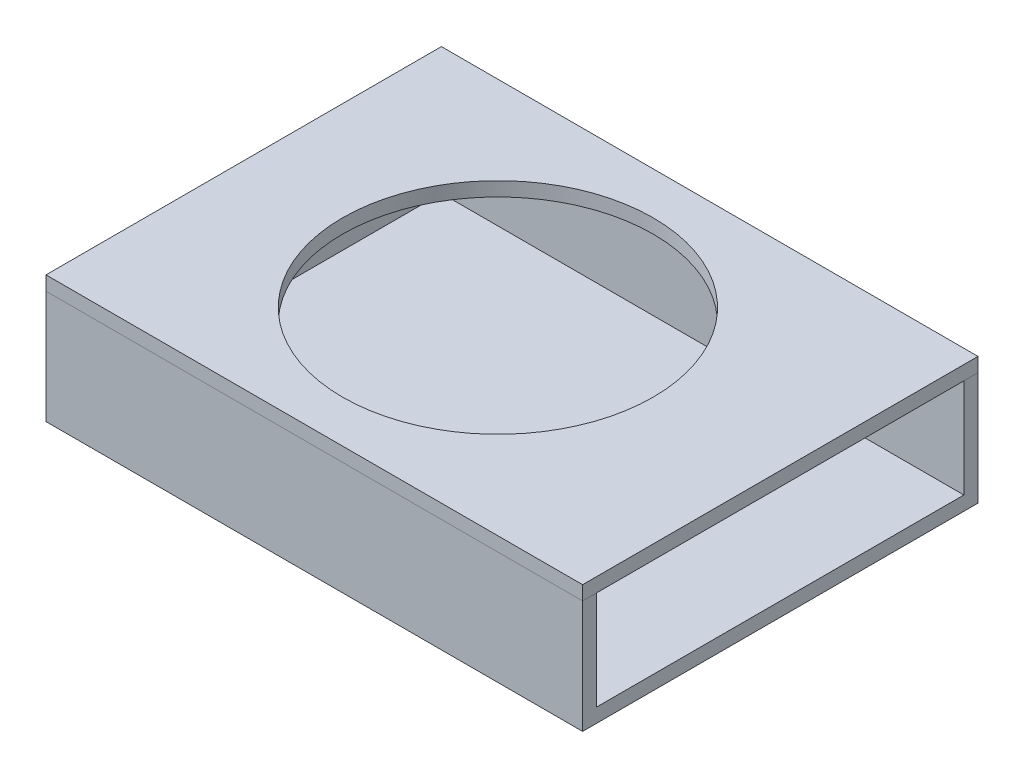
ISO-10303-21;
HEADER;
FILE_DESCRIPTION(('STEP AP214'),'2;1');
FILE_NAME('part.step','',(''),(''),'','','');
FILE_SCHEMA(('AUTOMOTIVE_DESIGN { 1 0 10303 214 1 1 1 1 }'));
ENDSEC;
DATA;
#1=APPLICATION_CONTEXT('core data for automotive mechanical design processes');
#2=APPLICATION_PROTOCOL_DEFINITION('international standard','automotive_design',2000,#1);
#3=PRODUCT_CONTEXT('',#1,'mechanical');
#4=PRODUCT('Part','Part','',(#3));
#5=PRODUCT_RELATED_PRODUCT_CATEGORY('part','',(#4));
#6=PRODUCT_DEFINITION_FORMATION('','',#4);
#7=PRODUCT_DEFINITION_CONTEXT('part definition',#1,'design');
#8=PRODUCT_DEFINITION('design','',#6,#7);
#9=PRODUCT_DEFINITION_SHAPE('','',#8);
#10=(LENGTH_UNIT() NAMED_UNIT(*) SI_UNIT(.MILLI.,.METRE.));
#11=(NAMED_UNIT(*) PLANE_ANGLE_UNIT() SI_UNIT($,.RADIAN.));
#12=(NAMED_UNIT(*) SI_UNIT($,.STERADIAN.) SOLID_ANGLE_UNIT());
#13=UNCERTAINTY_MEASURE_WITH_UNIT(LENGTH_MEASURE(1.E-05),#10,'distance_accuracy_value','');
#14=(GEOMETRIC_REPRESENTATION_CONTEXT(3) GLOBAL_UNCERTAINTY_ASSIGNED_CONTEXT((#13)) GLOBAL_UNIT_ASSIGNED_CONTEXT((#10,
#11,#12)) REPRESENTATION_CONTEXT('',''));
#15=CARTESIAN_POINT('',(0.,0.,0.));
#16=DIRECTION('',(0.,0.,1.));
#17=DIRECTION('',(1.,0.,0.));
#18=AXIS2_PLACEMENT_3D('',#15,#16,#17);
#19=CARTESIAN_POINT('',(-19.,9.,14.));
#20=DIRECTION('',(1.,0.,0.));
#21=DIRECTION('',(0.,0.,-1.));
#22=AXIS2_PLACEMENT_3D('',#19,#20,#21);
#23=PLANE('',#22);
#24=DIRECTION('',(0.,0.,1.));
#25=VECTOR('',#24,1.);
#26=CARTESIAN_POINT('',(-19.,8.,14.));
#27=LINE('',#26,#25);
#28=CARTESIAN_POINT('',(-19.,8.,-14.));
#29=VERTEX_POINT('',#28);
#30=CARTESIAN_POINT('',(-19.,8.,14.));
#31=VERTEX_POINT('',#30);
#32=EDGE_CURVE('E106',#29,#31,#27,.T.);
#33=ORIENTED_EDGE('',*,*,#32,.T.);
#34=DIRECTION('',(0.,-1.,0.));
#35=VECTOR('',#34,1.);
#36=CARTESIAN_POINT('',(-19.,9.,14.));
#37=LINE('',#36,#35);
#38=CARTESIAN_POINT('',(-19.,9.,14.));
#39=VERTEX_POINT('',#38);
#40=EDGE_CURVE('E12',#39,#31,#37,.T.);
#41=ORIENTED_EDGE('',*,*,#40,.F.);
#42=DIRECTION('',(0.,0.,1.));
#43=VECTOR('',#42,1.);
#44=CARTESIAN_POINT('',(-19.,9.,14.));
#45=LINE('',#44,#43);
#46=CARTESIAN_POINT('',(-19.,9.,-14.));
#47=VERTEX_POINT('',#46);
#48=EDGE_CURVE('E94',#47,#39,#45,.T.);
#49=ORIENTED_EDGE('',*,*,#48,.F.);
#50=DIRECTION('',(0.,-1.,0.));
#51=VECTOR('',#50,1.);
#52=CARTESIAN_POINT('',(-19.,9.,-14.));
#53=LINE('',#52,#51);
#54=EDGE_CURVE('E102',#47,#29,#53,.T.);
#55=ORIENTED_EDGE('',*,*,#54,.T.);
#56=EDGE_LOOP('',(#33,#41,#49,#55));
#57=FACE_BOUND('',#56,.T.);
#58=ADVANCED_FACE('F43',(#57),#23,.F.);
#59=CARTESIAN_POINT('',(19.,9.,14.));
#60=DIRECTION('',(0.,0.,-1.));
#61=DIRECTION('',(-1.,0.,0.));
#62=AXIS2_PLACEMENT_3D('',#59,#60,#61);
#63=PLANE('',#62);
#64=DIRECTION('',(1.,0.,0.));
#65=VECTOR('',#64,1.);
#66=CARTESIAN_POINT('',(19.,8.,14.));
#67=LINE('',#66,#65);
#68=CARTESIAN_POINT('',(19.,8.,14.));
#69=VERTEX_POINT('',#68);
#70=EDGE_CURVE('E98',#31,#69,#67,.T.);
#71=ORIENTED_EDGE('',*,*,#70,.T.);
#72=DIRECTION('',(0.,-1.,0.));
#73=VECTOR('',#72,1.);
#74=CARTESIAN_POINT('',(19.,9.,14.));
#75=LINE('',#74,#73);
#76=CARTESIAN_POINT('',(19.,9.,14.));
#77=VERTEX_POINT('',#76);
#78=EDGE_CURVE('E51',#77,#69,#75,.T.);
#79=ORIENTED_EDGE('',*,*,#78,.F.);
#80=DIRECTION('',(1.,0.,0.));
#81=VECTOR('',#80,1.);
#82=CARTESIAN_POINT('',(19.,9.,14.));
#83=LINE('',#82,#81);
#84=EDGE_CURVE('E89',#39,#77,#83,.T.);
#85=ORIENTED_EDGE('',*,*,#84,.F.);
#86=ORIENTED_EDGE('',*,*,#40,.T.);
#87=EDGE_LOOP('',(#71,#79,#85,#86));
#88=FACE_BOUND('',#87,.T.);
#89=ADVANCED_FACE('F97',(#88),#63,.F.);
#90=CARTESIAN_POINT('',(19.,9.,14.));
#91=DIRECTION('',(-1.,0.,0.));
#92=DIRECTION('',(0.,0.,1.));
#93=AXIS2_PLACEMENT_3D('',#90,#91,#92);
#94=PLANE('',#93);
#95=DIRECTION('',(0.,0.,-1.));
#96=VECTOR('',#95,1.);
#97=CARTESIAN_POINT('',(19.,8.,14.));
#98=LINE('',#97,#96);
#99=CARTESIAN_POINT('',(19.,8.,-14.));
#100=VERTEX_POINT('',#99);
#101=EDGE_CURVE('E76',#69,#100,#98,.T.);
#102=ORIENTED_EDGE('',*,*,#101,.T.);
#103=DIRECTION('',(0.,-1.,0.));
#104=VECTOR('',#103,1.);
#105=CARTESIAN_POINT('',(19.,9.,-14.));
#106=LINE('',#105,#104);
#107=CARTESIAN_POINT('',(19.,9.,-14.));
#108=VERTEX_POINT('',#107);
#109=EDGE_CURVE('E99',#108,#100,#106,.T.);
#110=ORIENTED_EDGE('',*,*,#109,.F.);
#111=DIRECTION('',(0.,0.,-1.));
#112=VECTOR('',#111,1.);
#113=CARTESIAN_POINT('',(19.,9.,14.));
#114=LINE('',#113,#112);
#115=EDGE_CURVE('E92',#77,#108,#114,.T.);
#116=ORIENTED_EDGE('',*,*,#115,.F.);
#117=ORIENTED_EDGE('',*,*,#78,.T.);
#118=EDGE_LOOP('',(#102,#110,#116,#117));
#119=FACE_BOUND('',#118,.T.);
#120=ADVANCED_FACE('F100',(#119),#94,.F.);
#121=CARTESIAN_POINT('',(19.,9.,-14.));
#122=DIRECTION('',(0.,0.,1.));
#123=DIRECTION('',(1.,0.,0.));
#124=AXIS2_PLACEMENT_3D('',#121,#122,#123);
#125=PLANE('',#124);
#126=DIRECTION('',(-1.,0.,0.));
#127=VECTOR('',#126,1.);
#128=CARTESIAN_POINT('',(19.,8.,-14.));
#129=LINE('',#128,#127);
#130=EDGE_CURVE('E82',#100,#29,#129,.T.);
#131=ORIENTED_EDGE('',*,*,#130,.T.);
#132=ORIENTED_EDGE('',*,*,#54,.F.);
#133=DIRECTION('',(-1.,0.,0.));
#134=VECTOR('',#133,1.);
#135=CARTESIAN_POINT('',(19.,9.,-14.));
#136=LINE('',#135,#134);
#137=EDGE_CURVE('E59',#108,#47,#136,.T.);
#138=ORIENTED_EDGE('',*,*,#137,.F.);
#139=ORIENTED_EDGE('',*,*,#109,.T.);
#140=EDGE_LOOP('',(#131,#132,#138,#139));
#141=FACE_BOUND('',#140,.T.);
#142=ADVANCED_FACE('F114',(#141),#125,.F.);
#143=CARTESIAN_POINT('',(0.,9.,0.));
#144=DIRECTION('',(0.,1.,0.));
#145=DIRECTION('',(0.,0.,1.));
#146=AXIS2_PLACEMENT_3D('',#143,#144,#145);
#147=PLANE('',#146);
#148=CARTESIAN_POINT('',(-1.00000000000001,9.,0.));
#149=DIRECTION('',(0.,1.,0.));
#150=DIRECTION('',(0.,0.,1.));
#151=AXIS2_PLACEMENT_3D('',#148,#149,#150);
#152=CIRCLE('',#151,11.);
#153=CARTESIAN_POINT('',(-1.00000000000001,9.,11.));
#154=VERTEX_POINT('',#153);
#155=EDGE_CURVE('E120',#154,#154,#152,.T.);
#156=ORIENTED_EDGE('',*,*,#155,.F.);
#157=EDGE_LOOP('',(#156));
#158=FACE_BOUND('',#157,.T.);
#159=ORIENTED_EDGE('',*,*,#48,.T.);
#160=ORIENTED_EDGE('',*,*,#84,.T.);
#161=ORIENTED_EDGE('',*,*,#115,.T.);
#162=ORIENTED_EDGE('',*,*,#137,.T.);
#163=EDGE_LOOP('',(#159,#160,#161,#162));
#164=FACE_BOUND('',#163,.T.);
#165=ADVANCED_FACE('F90',(#158,#164),#147,.T.);
#166=CARTESIAN_POINT('',(0.,8.,0.));
#167=DIRECTION('',(0.,1.,0.));
#168=DIRECTION('',(0.,0.,1.));
#169=AXIS2_PLACEMENT_3D('',#166,#167,#168);
#170=PLANE('',#169);
#171=CARTESIAN_POINT('',(-1.00000000000001,8.,0.));
#172=DIRECTION('',(0.,1.,0.));
#173=DIRECTION('',(0.,0.,1.));
#174=AXIS2_PLACEMENT_3D('',#171,#172,#173);
#175=CIRCLE('',#174,11.);
#176=CARTESIAN_POINT('',(-1.00000000000001,8.,11.));
#177=VERTEX_POINT('',#176);
#178=EDGE_CURVE('E109',#177,#177,#175,.T.);
#179=ORIENTED_EDGE('',*,*,#178,.T.);
#180=EDGE_LOOP('',(#179));
#181=FACE_BOUND('',#180,.T.);
#182=ORIENTED_EDGE('',*,*,#32,.F.);
#183=ORIENTED_EDGE('',*,*,#130,.F.);
#184=ORIENTED_EDGE('',*,*,#101,.F.);
#185=ORIENTED_EDGE('',*,*,#70,.F.);
#186=EDGE_LOOP('',(#182,#183,#184,#185));
#187=FACE_BOUND('',#186,.T.);
#188=ADVANCED_FACE('F117',(#181,#187),#170,.F.);
#189=CARTESIAN_POINT('',(-1.00000000000001,8.,0.));
#190=DIRECTION('',(0.,1.,0.));
#191=DIRECTION('',(0.,0.,1.));
#192=AXIS2_PLACEMENT_3D('',#189,#190,#191);
#193=CYLINDRICAL_SURFACE('',#192,11.);
#194=ORIENTED_EDGE('',*,*,#178,.F.);
#195=EDGE_LOOP('',(#194));
#196=FACE_BOUND('',#195,.T.);
#197=ORIENTED_EDGE('',*,*,#155,.T.);
#198=EDGE_LOOP('',(#197));
#199=FACE_BOUND('',#198,.T.);
#200=ADVANCED_FACE('F127',(#196,#199),#193,.F.);
#201=CLOSED_SHELL('',(#58,#89,#120,#142,#165,#188,#200));
#202=MANIFOLD_SOLID_BREP('B2',#201);
#203=CARTESIAN_POINT('',(19.,8.,14.));
#204=DIRECTION('',(-1.,0.,0.));
#205=DIRECTION('',(0.,0.,1.));
#206=AXIS2_PLACEMENT_3D('',#203,#204,#205);
#207=PLANE('',#206);
#208=DIRECTION('',(0.,-1.,0.));
#209=VECTOR('',#208,1.);
#210=CARTESIAN_POINT('',(19.,8.,13.));
#211=LINE('',#210,#209);
#212=CARTESIAN_POINT('',(19.,8.,13.));
#213=VERTEX_POINT('',#212);
#214=CARTESIAN_POINT('',(19.,1.,13.));
#215=VERTEX_POINT('',#214);
#216=EDGE_CURVE('E282',#213,#215,#211,.T.);
#217=ORIENTED_EDGE('',*,*,#216,.F.);
#218=DIRECTION('',(0.,0.,-1.));
#219=VECTOR('',#218,1.);
#220=CARTESIAN_POINT('',(19.,8.,14.));
#221=LINE('',#220,#219);
#222=CARTESIAN_POINT('',(19.,8.,14.));
#223=VERTEX_POINT('',#222);
#224=EDGE_CURVE('E287',#223,#213,#221,.T.);
#225=ORIENTED_EDGE('',*,*,#224,.F.);
#226=DIRECTION('',(0.,-1.,0.));
#227=VECTOR('',#226,1.);
#228=CARTESIAN_POINT('',(19.,8.,14.));
#229=LINE('',#228,#227);
#230=CARTESIAN_POINT('',(19.,0.,14.));
#231=VERTEX_POINT('',#230);
#232=EDGE_CURVE('E196',#223,#231,#229,.T.);
#233=ORIENTED_EDGE('',*,*,#232,.T.);
#234=DIRECTION('',(0.,0.,-1.));
#235=VECTOR('',#234,1.);
#236=CARTESIAN_POINT('',(19.,0.,14.));
#237=LINE('',#236,#235);
#238=CARTESIAN_POINT('',(19.,0.,-14.));
#239=VERTEX_POINT('',#238);
#240=EDGE_CURVE('E312',#231,#239,#237,.T.);
#241=ORIENTED_EDGE('',*,*,#240,.T.);
#242=DIRECTION('',(0.,-1.,0.));
#243=VECTOR('',#242,1.);
#244=CARTESIAN_POINT('',(19.,8.,-14.));
#245=LINE('',#244,#243);
#246=CARTESIAN_POINT('',(19.,8.,-14.));
#247=VERTEX_POINT('',#246);
#248=EDGE_CURVE('E316',#247,#239,#245,.T.);
#249=ORIENTED_EDGE('',*,*,#248,.F.);
#250=CARTESIAN_POINT('',(19.,8.,-13.));
#251=VERTEX_POINT('',#250);
#252=EDGE_CURVE('E304',#251,#247,#221,.T.);
#253=ORIENTED_EDGE('',*,*,#252,.F.);
#254=DIRECTION('',(0.,-1.,0.));
#255=VECTOR('',#254,1.);
#256=CARTESIAN_POINT('',(19.,8.,-13.));
#257=LINE('',#256,#255);
#258=CARTESIAN_POINT('',(19.,1.,-13.));
#259=VERTEX_POINT('',#258);
#260=EDGE_CURVE('E203',#251,#259,#257,.T.);
#261=ORIENTED_EDGE('',*,*,#260,.T.);
#262=DIRECTION('',(0.,0.,-1.));
#263=VECTOR('',#262,1.);
#264=CARTESIAN_POINT('',(19.,1.,-13.));
#265=LINE('',#264,#263);
#266=EDGE_CURVE('E295',#215,#259,#265,.T.);
#267=ORIENTED_EDGE('',*,*,#266,.F.);
#268=EDGE_LOOP('',(#217,#225,#233,#241,#249,#253,#261,#267));
#269=FACE_BOUND('',#268,.T.);
#270=ADVANCED_FACE('F188',(#269),#207,.F.);
#271=CARTESIAN_POINT('',(0.,8.,0.));
#272=DIRECTION('',(0.,1.,0.));
#273=DIRECTION('',(0.,0.,1.));
#274=AXIS2_PLACEMENT_3D('',#271,#272,#273);
#275=PLANE('',#274);
#276=ORIENTED_EDGE('',*,*,#224,.T.);
#277=DIRECTION('',(1.,0.,0.));
#278=VECTOR('',#277,1.);
#279=CARTESIAN_POINT('',(-18.,8.,13.));
#280=LINE('',#279,#278);
#281=CARTESIAN_POINT('',(-18.,8.,13.));
#282=VERTEX_POINT('',#281);
#283=EDGE_CURVE('E273',#282,#213,#280,.T.);
#284=ORIENTED_EDGE('',*,*,#283,.F.);
#285=DIRECTION('',(0.,0.,1.));
#286=VECTOR('',#285,1.);
#287=CARTESIAN_POINT('',(-18.,8.,-13.));
#288=LINE('',#287,#286);
#289=CARTESIAN_POINT('',(-18.,8.,-13.));
#290=VERTEX_POINT('',#289);
#291=EDGE_CURVE('E264',#290,#282,#288,.T.);
#292=ORIENTED_EDGE('',*,*,#291,.F.);
#293=DIRECTION('',(-1.,0.,0.));
#294=VECTOR('',#293,1.);
#295=CARTESIAN_POINT('',(-18.,8.,-13.));
#296=LINE('',#295,#294);
#297=EDGE_CURVE('E288',#251,#290,#296,.T.);
#298=ORIENTED_EDGE('',*,*,#297,.F.);
#299=ORIENTED_EDGE('',*,*,#252,.T.);
#300=DIRECTION('',(-1.,0.,0.));
#301=VECTOR('',#300,1.);
#302=CARTESIAN_POINT('',(19.,8.,-14.));
#303=LINE('',#302,#301);
#304=CARTESIAN_POINT('',(-19.,8.,-14.));
#305=VERTEX_POINT('',#304);
#306=EDGE_CURVE('E212',#247,#305,#303,.T.);
#307=ORIENTED_EDGE('',*,*,#306,.T.);
#308=DIRECTION('',(0.,0.,1.));
#309=VECTOR('',#308,1.);
#310=CARTESIAN_POINT('',(-19.,8.,14.));
#311=LINE('',#310,#309);
#312=CARTESIAN_POINT('',(-19.,8.,14.));
#313=VERTEX_POINT('',#312);
#314=EDGE_CURVE('E301',#305,#313,#311,.T.);
#315=ORIENTED_EDGE('',*,*,#314,.T.);
#316=DIRECTION('',(1.,0.,0.));
#317=VECTOR('',#316,1.);
#318=CARTESIAN_POINT('',(19.,8.,14.));
#319=LINE('',#318,#317);
#320=EDGE_CURVE('E240',#313,#223,#319,.T.);
#321=ORIENTED_EDGE('',*,*,#320,.T.);
#322=EDGE_LOOP('',(#276,#284,#292,#298,#299,#307,#315,#321));
#323=FACE_BOUND('',#322,.T.);
#324=ADVANCED_FACE('F285',(#323),#275,.T.);
#325=CARTESIAN_POINT('',(-19.,8.,14.));
#326=DIRECTION('',(1.,0.,0.));
#327=DIRECTION('',(0.,0.,-1.));
#328=AXIS2_PLACEMENT_3D('',#325,#326,#327);
#329=PLANE('',#328);
#330=DIRECTION('',(0.,0.,1.));
#331=VECTOR('',#330,1.);
#332=CARTESIAN_POINT('',(-19.,0.,14.));
#333=LINE('',#332,#331);
#334=CARTESIAN_POINT('',(-19.,0.,-14.));
#335=VERTEX_POINT('',#334);
#336=CARTESIAN_POINT('',(-19.,0.,14.));
#337=VERTEX_POINT('',#336);
#338=EDGE_CURVE('E281',#335,#337,#333,.T.);
#339=ORIENTED_EDGE('',*,*,#338,.T.);
#340=DIRECTION('',(0.,-1.,0.));
#341=VECTOR('',#340,1.);
#342=CARTESIAN_POINT('',(-19.,8.,14.));
#343=LINE('',#342,#341);
#344=EDGE_CURVE('E41',#313,#337,#343,.T.);
#345=ORIENTED_EDGE('',*,*,#344,.F.);
#346=ORIENTED_EDGE('',*,*,#314,.F.);
#347=DIRECTION('',(0.,-1.,0.));
#348=VECTOR('',#347,1.);
#349=CARTESIAN_POINT('',(-19.,8.,-14.));
#350=LINE('',#349,#348);
#351=EDGE_CURVE('E307',#305,#335,#350,.T.);
#352=ORIENTED_EDGE('',*,*,#351,.T.);
#353=EDGE_LOOP('',(#339,#345,#346,#352));
#354=FACE_BOUND('',#353,.T.);
#355=ADVANCED_FACE('F190',(#354),#329,.F.);
#356=CARTESIAN_POINT('',(19.,8.,14.));
#357=DIRECTION('',(0.,0.,-1.));
#358=DIRECTION('',(-1.,0.,0.));
#359=AXIS2_PLACEMENT_3D('',#356,#357,#358);
#360=PLANE('',#359);
#361=DIRECTION('',(1.,0.,0.));
#362=VECTOR('',#361,1.);
#363=CARTESIAN_POINT('',(19.,0.,14.));
#364=LINE('',#363,#362);
#365=EDGE_CURVE('E310',#337,#231,#364,.T.);
#366=ORIENTED_EDGE('',*,*,#365,.T.);
#367=ORIENTED_EDGE('',*,*,#232,.F.);
#368=ORIENTED_EDGE('',*,*,#320,.F.);
#369=ORIENTED_EDGE('',*,*,#344,.T.);
#370=EDGE_LOOP('',(#366,#367,#368,#369));
#371=FACE_BOUND('',#370,.T.);
#372=ADVANCED_FACE('F347',(#371),#360,.F.);
#373=CARTESIAN_POINT('',(19.,8.,-14.));
#374=DIRECTION('',(0.,0.,1.));
#375=DIRECTION('',(1.,0.,0.));
#376=AXIS2_PLACEMENT_3D('',#373,#374,#375);
#377=PLANE('',#376);
#378=DIRECTION('',(-1.,0.,0.));
#379=VECTOR('',#378,1.);
#380=CARTESIAN_POINT('',(19.,0.,-14.));
#381=LINE('',#380,#379);
#382=EDGE_CURVE('E233',#239,#335,#381,.T.);
#383=ORIENTED_EDGE('',*,*,#382,.T.);
#384=ORIENTED_EDGE('',*,*,#351,.F.);
#385=ORIENTED_EDGE('',*,*,#306,.F.);
#386=ORIENTED_EDGE('',*,*,#248,.T.);
#387=EDGE_LOOP('',(#383,#384,#385,#386));
#388=FACE_BOUND('',#387,.T.);
#389=ADVANCED_FACE('F327',(#388),#377,.F.);
#390=CARTESIAN_POINT('',(0.,0.,0.));
#391=DIRECTION('',(0.,1.,0.));
#392=DIRECTION('',(0.,0.,1.));
#393=AXIS2_PLACEMENT_3D('',#390,#391,#392);
#394=PLANE('',#393);
#395=ORIENTED_EDGE('',*,*,#338,.F.);
#396=ORIENTED_EDGE('',*,*,#382,.F.);
#397=ORIENTED_EDGE('',*,*,#240,.F.);
#398=ORIENTED_EDGE('',*,*,#365,.F.);
#399=EDGE_LOOP('',(#395,#396,#397,#398));
#400=FACE_BOUND('',#399,.T.);
#401=ADVANCED_FACE('F323',(#400),#394,.F.);
#402=CARTESIAN_POINT('',(-18.,8.,-13.));
#403=DIRECTION('',(1.,0.,0.));
#404=DIRECTION('',(0.,0.,-1.));
#405=AXIS2_PLACEMENT_3D('',#402,#403,#404);
#406=PLANE('',#405);
#407=DIRECTION('',(0.,0.,1.));
#408=VECTOR('',#407,1.);
#409=CARTESIAN_POINT('',(-18.,1.,-13.));
#410=LINE('',#409,#408);
#411=CARTESIAN_POINT('',(-18.,1.,-13.));
#412=VERTEX_POINT('',#411);
#413=CARTESIAN_POINT('',(-18.,1.,13.));
#414=VERTEX_POINT('',#413);
#415=EDGE_CURVE('E292',#412,#414,#410,.T.);
#416=ORIENTED_EDGE('',*,*,#415,.F.);
#417=DIRECTION('',(0.,-1.,0.));
#418=VECTOR('',#417,1.);
#419=CARTESIAN_POINT('',(-18.,8.,-13.));
#420=LINE('',#419,#418);
#421=EDGE_CURVE('E271',#290,#412,#420,.T.);
#422=ORIENTED_EDGE('',*,*,#421,.F.);
#423=ORIENTED_EDGE('',*,*,#291,.T.);
#424=DIRECTION('',(0.,-1.,0.));
#425=VECTOR('',#424,1.);
#426=CARTESIAN_POINT('',(-18.,8.,13.));
#427=LINE('',#426,#425);
#428=EDGE_CURVE('E268',#282,#414,#427,.T.);
#429=ORIENTED_EDGE('',*,*,#428,.T.);
#430=EDGE_LOOP('',(#416,#422,#423,#429));
#431=FACE_BOUND('',#430,.T.);
#432=ADVANCED_FACE('F267',(#431),#406,.T.);
#433=CARTESIAN_POINT('',(-18.,8.,13.));
#434=DIRECTION('',(0.,0.,-1.));
#435=DIRECTION('',(-1.,0.,0.));
#436=AXIS2_PLACEMENT_3D('',#433,#434,#435);
#437=PLANE('',#436);
#438=DIRECTION('',(1.,0.,0.));
#439=VECTOR('',#438,1.);
#440=CARTESIAN_POINT('',(-18.,1.,13.));
#441=LINE('',#440,#439);
#442=EDGE_CURVE('E280',#414,#215,#441,.T.);
#443=ORIENTED_EDGE('',*,*,#442,.F.);
#444=ORIENTED_EDGE('',*,*,#428,.F.);
#445=ORIENTED_EDGE('',*,*,#283,.T.);
#446=ORIENTED_EDGE('',*,*,#216,.T.);
#447=EDGE_LOOP('',(#443,#444,#445,#446));
#448=FACE_BOUND('',#447,.T.);
#449=ADVANCED_FACE('F277',(#448),#437,.T.);
#450=CARTESIAN_POINT('',(-18.,8.,-13.));
#451=DIRECTION('',(0.,0.,1.));
#452=DIRECTION('',(1.,0.,0.));
#453=AXIS2_PLACEMENT_3D('',#450,#451,#452);
#454=PLANE('',#453);
#455=DIRECTION('',(-1.,0.,0.));
#456=VECTOR('',#455,1.);
#457=CARTESIAN_POINT('',(-18.,1.,-13.));
#458=LINE('',#457,#456);
#459=EDGE_CURVE('E274',#259,#412,#458,.T.);
#460=ORIENTED_EDGE('',*,*,#459,.F.);
#461=ORIENTED_EDGE('',*,*,#260,.F.);
#462=ORIENTED_EDGE('',*,*,#297,.T.);
#463=ORIENTED_EDGE('',*,*,#421,.T.);
#464=EDGE_LOOP('',(#460,#461,#462,#463));
#465=FACE_BOUND('',#464,.T.);
#466=ADVANCED_FACE('F330',(#465),#454,.T.);
#467=CARTESIAN_POINT('',(0.,1.,0.));
#468=DIRECTION('',(0.,1.,0.));
#469=DIRECTION('',(0.,0.,1.));
#470=AXIS2_PLACEMENT_3D('',#467,#468,#469);
#471=PLANE('',#470);
#472=ORIENTED_EDGE('',*,*,#415,.T.);
#473=ORIENTED_EDGE('',*,*,#442,.T.);
#474=ORIENTED_EDGE('',*,*,#266,.T.);
#475=ORIENTED_EDGE('',*,*,#459,.T.);
#476=EDGE_LOOP('',(#472,#473,#474,#475));
#477=FACE_BOUND('',#476,.T.);
#478=ADVANCED_FACE('F332',(#477),#471,.T.);
#479=CLOSED_SHELL('',(#270,#324,#355,#372,#389,#401,#432,#449,#466,#478));
#480=MANIFOLD_SOLID_BREP('B6',#479);
#481=ADVANCED_BREP_SHAPE_REPRESENTATION('',(#18,#202,#480),#14);
#482=SHAPE_DEFINITION_REPRESENTATION(#9,#481);
ENDSEC;
END-ISO-10303-21;
